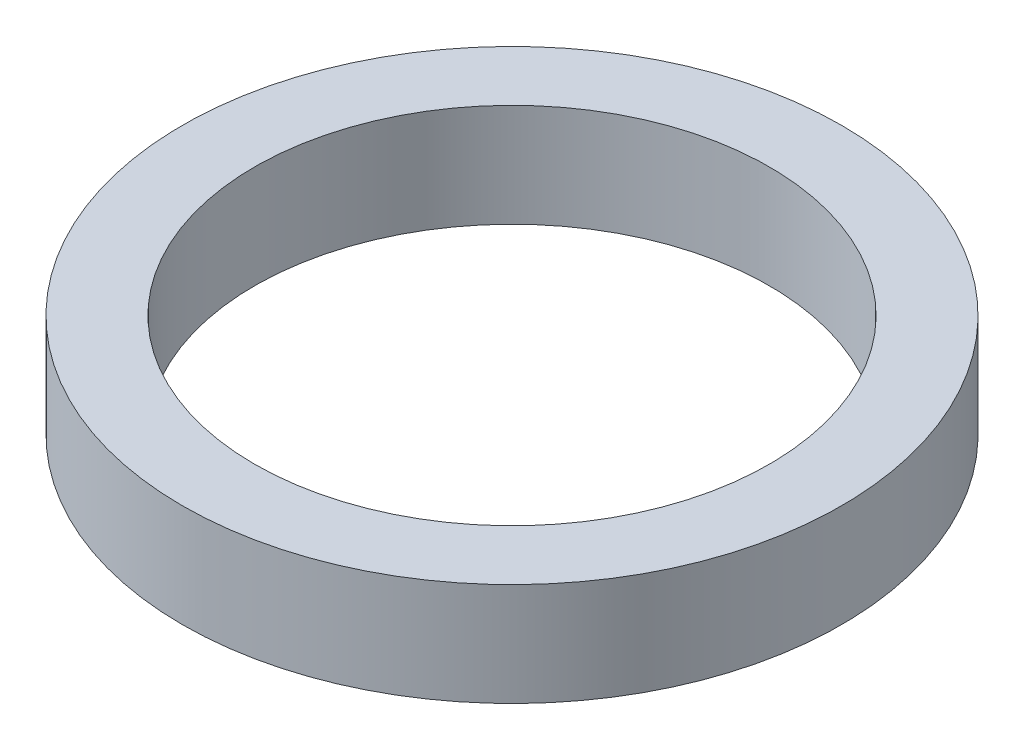
ISO-10303-21;
HEADER;
FILE_DESCRIPTION(('STEP AP214'),'2;1');
FILE_NAME('part.step','',(''),(''),'','','');
FILE_SCHEMA(('AUTOMOTIVE_DESIGN { 1 0 10303 214 1 1 1 1 }'));
ENDSEC;
DATA;
#1=APPLICATION_CONTEXT('core data for automotive mechanical design processes');
#2=APPLICATION_PROTOCOL_DEFINITION('international standard','automotive_design',2000,#1);
#3=PRODUCT_CONTEXT('',#1,'mechanical');
#4=PRODUCT('Part','Part','',(#3));
#5=PRODUCT_RELATED_PRODUCT_CATEGORY('part','',(#4));
#6=PRODUCT_DEFINITION_FORMATION('','',#4);
#7=PRODUCT_DEFINITION_CONTEXT('part definition',#1,'design');
#8=PRODUCT_DEFINITION('design','',#6,#7);
#9=PRODUCT_DEFINITION_SHAPE('','',#8);
#10=(LENGTH_UNIT() NAMED_UNIT(*) SI_UNIT(.MILLI.,.METRE.));
#11=(NAMED_UNIT(*) PLANE_ANGLE_UNIT() SI_UNIT($,.RADIAN.));
#12=(NAMED_UNIT(*) SI_UNIT($,.STERADIAN.) SOLID_ANGLE_UNIT());
#13=UNCERTAINTY_MEASURE_WITH_UNIT(LENGTH_MEASURE(1.E-05),#10,'distance_accuracy_value','');
#14=(GEOMETRIC_REPRESENTATION_CONTEXT(3) GLOBAL_UNCERTAINTY_ASSIGNED_CONTEXT((#13)) GLOBAL_UNIT_ASSIGNED_CONTEXT((#10,
#11,#12)) REPRESENTATION_CONTEXT('',''));
#15=CARTESIAN_POINT('',(0.,0.,0.));
#16=DIRECTION('',(0.,0.,1.));
#17=DIRECTION('',(1.,0.,0.));
#18=AXIS2_PLACEMENT_3D('',#15,#16,#17);
#19=CARTESIAN_POINT('',(0.,2.5,0.));
#20=DIRECTION('',(0.,-1.,0.));
#21=DIRECTION('',(0.,0.,-1.));
#22=AXIS2_PLACEMENT_3D('',#19,#20,#21);
#23=CYLINDRICAL_SURFACE('',#22,8.);
#24=CARTESIAN_POINT('',(0.,2.5,0.));
#25=DIRECTION('',(0.,1.,0.));
#26=DIRECTION('',(0.,0.,1.));
#27=AXIS2_PLACEMENT_3D('',#24,#25,#26);
#28=CIRCLE('',#27,8.);
#29=CARTESIAN_POINT('',(0.,2.5,8.));
#30=VERTEX_POINT('',#29);
#31=EDGE_CURVE('E10',#30,#30,#28,.T.);
#32=ORIENTED_EDGE('',*,*,#31,.F.);
#33=EDGE_LOOP('',(#32));
#34=FACE_BOUND('',#33,.T.);
#35=CARTESIAN_POINT('',(0.,0.,0.));
#36=DIRECTION('',(0.,1.,0.));
#37=DIRECTION('',(0.,0.,1.));
#38=AXIS2_PLACEMENT_3D('',#35,#36,#37);
#39=CIRCLE('',#38,8.);
#40=CARTESIAN_POINT('',(0.,0.,8.));
#41=VERTEX_POINT('',#40);
#42=EDGE_CURVE('E39',#41,#41,#39,.T.);
#43=ORIENTED_EDGE('',*,*,#42,.T.);
#44=EDGE_LOOP('',(#43));
#45=FACE_BOUND('',#44,.T.);
#46=ADVANCED_FACE('F32',(#34,#45),#23,.T.);
#47=CARTESIAN_POINT('',(0.,2.5,0.));
#48=DIRECTION('',(0.,1.,0.));
#49=DIRECTION('',(0.,0.,1.));
#50=AXIS2_PLACEMENT_3D('',#47,#48,#49);
#51=PLANE('',#50);
#52=CARTESIAN_POINT('',(0.,2.5,0.));
#53=DIRECTION('',(0.,1.,0.));
#54=DIRECTION('',(0.,0.,1.));
#55=AXIS2_PLACEMENT_3D('',#52,#53,#54);
#56=CIRCLE('',#55,6.25);
#57=CARTESIAN_POINT('',(0.,2.5,6.25));
#58=VERTEX_POINT('',#57);
#59=EDGE_CURVE('E44',#58,#58,#56,.T.);
#60=ORIENTED_EDGE('',*,*,#59,.F.);
#61=EDGE_LOOP('',(#60));
#62=FACE_BOUND('',#61,.T.);
#63=ORIENTED_EDGE('',*,*,#31,.T.);
#64=EDGE_LOOP('',(#63));
#65=FACE_BOUND('',#64,.T.);
#66=ADVANCED_FACE('F61',(#62,#65),#51,.T.);
#67=CARTESIAN_POINT('',(0.,0.,0.));
#68=DIRECTION('',(0.,1.,0.));
#69=DIRECTION('',(0.,0.,1.));
#70=AXIS2_PLACEMENT_3D('',#67,#68,#69);
#71=PLANE('',#70);
#72=CARTESIAN_POINT('',(0.,0.,0.));
#73=DIRECTION('',(0.,1.,0.));
#74=DIRECTION('',(0.,0.,1.));
#75=AXIS2_PLACEMENT_3D('',#72,#73,#74);
#76=CIRCLE('',#75,6.25);
#77=CARTESIAN_POINT('',(0.,0.,6.25));
#78=VERTEX_POINT('',#77);
#79=EDGE_CURVE('E35',#78,#78,#76,.T.);
#80=ORIENTED_EDGE('',*,*,#79,.T.);
#81=EDGE_LOOP('',(#80));
#82=FACE_BOUND('',#81,.T.);
#83=ORIENTED_EDGE('',*,*,#42,.F.);
#84=EDGE_LOOP('',(#83));
#85=FACE_BOUND('',#84,.T.);
#86=ADVANCED_FACE('F52',(#82,#85),#71,.F.);
#87=CARTESIAN_POINT('',(0.,-22.5,0.));
#88=DIRECTION('',(0.,1.,0.));
#89=DIRECTION('',(0.,0.,1.));
#90=AXIS2_PLACEMENT_3D('',#87,#88,#89);
#91=CYLINDRICAL_SURFACE('',#90,6.25);
#92=ORIENTED_EDGE('',*,*,#59,.T.);
#93=EDGE_LOOP('',(#92));
#94=FACE_BOUND('',#93,.T.);
#95=ORIENTED_EDGE('',*,*,#79,.F.);
#96=EDGE_LOOP('',(#95));
#97=FACE_BOUND('',#96,.T.);
#98=ADVANCED_FACE('F55',(#94,#97),#91,.F.);
#99=CLOSED_SHELL('',(#46,#66,#86,#98));
#100=MANIFOLD_SOLID_BREP('B2',#99);
#101=ADVANCED_BREP_SHAPE_REPRESENTATION('',(#18,#100),#14);
#102=SHAPE_DEFINITION_REPRESENTATION(#9,#101);
ENDSEC;
END-ISO-10303-21;
